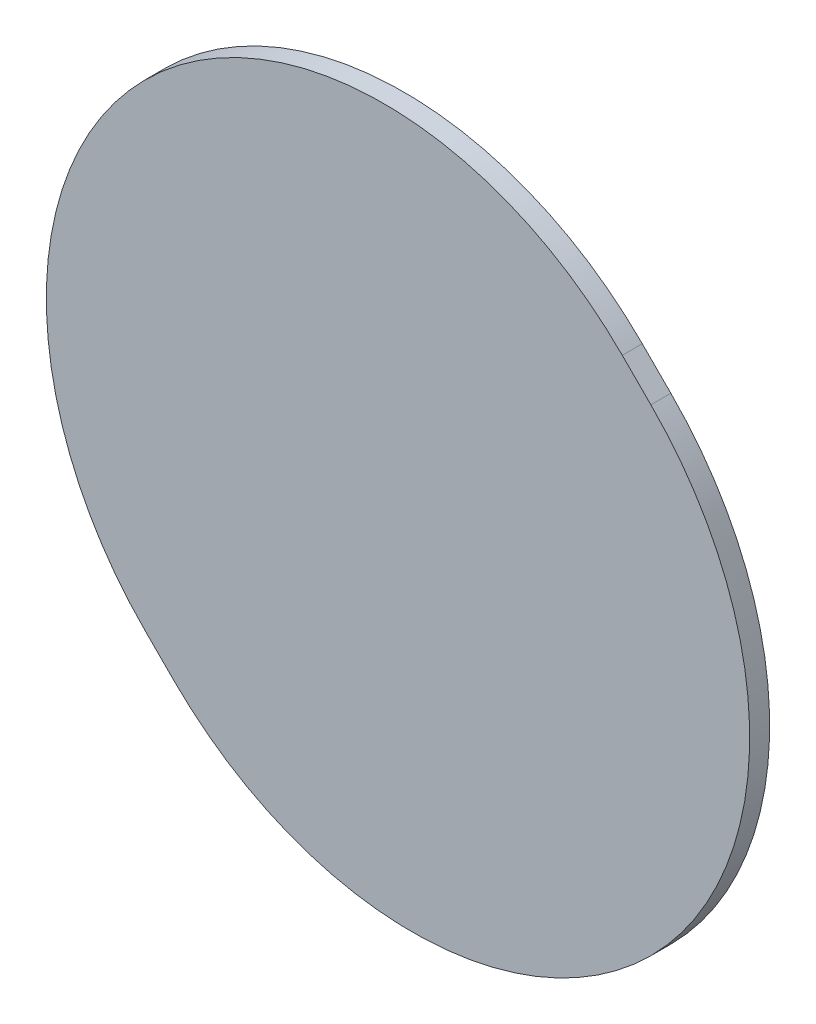
ISO-10303-21;
HEADER;
FILE_DESCRIPTION(('STEP AP214'),'2;1');
FILE_NAME('part.step','',(''),(''),'','','');
FILE_SCHEMA(('AUTOMOTIVE_DESIGN { 1 0 10303 214 1 1 1 1 }'));
ENDSEC;
DATA;
#1=APPLICATION_CONTEXT('core data for automotive mechanical design processes');
#2=APPLICATION_PROTOCOL_DEFINITION('international standard','automotive_design',2000,#1);
#3=PRODUCT_CONTEXT('',#1,'mechanical');
#4=PRODUCT('Part','Part','',(#3));
#5=PRODUCT_RELATED_PRODUCT_CATEGORY('part','',(#4));
#6=PRODUCT_DEFINITION_FORMATION('','',#4);
#7=PRODUCT_DEFINITION_CONTEXT('part definition',#1,'design');
#8=PRODUCT_DEFINITION('design','',#6,#7);
#9=PRODUCT_DEFINITION_SHAPE('','',#8);
#10=(LENGTH_UNIT() NAMED_UNIT(*) SI_UNIT(.MILLI.,.METRE.));
#11=(NAMED_UNIT(*) PLANE_ANGLE_UNIT() SI_UNIT($,.RADIAN.));
#12=(NAMED_UNIT(*) SI_UNIT($,.STERADIAN.) SOLID_ANGLE_UNIT());
#13=UNCERTAINTY_MEASURE_WITH_UNIT(LENGTH_MEASURE(1.E-05),#10,'distance_accuracy_value','');
#14=(GEOMETRIC_REPRESENTATION_CONTEXT(3) GLOBAL_UNCERTAINTY_ASSIGNED_CONTEXT((#13)) GLOBAL_UNIT_ASSIGNED_CONTEXT((#10,
#11,#12)) REPRESENTATION_CONTEXT('',''));
#15=CARTESIAN_POINT('',(0.,0.,0.));
#16=DIRECTION('',(0.,0.,1.));
#17=DIRECTION('',(1.,0.,0.));
#18=AXIS2_PLACEMENT_3D('',#15,#16,#17);
#19=CARTESIAN_POINT('',(90.76173618,70.20658298,0.));
#20=DIRECTION('',(0.707106781186548,0.707106781186548,0.));
#21=DIRECTION('',(0.707106781186548,-0.707106781186548,0.));
#22=AXIS2_PLACEMENT_3D('',#19,#20,#21);
#23=PLANE('',#22);
#24=DIRECTION('',(0.707106781186548,-0.707106781186548,0.));
#25=VECTOR('',#24,1.);
#26=CARTESIAN_POINT('',(90.76173618,70.20658298,0.03556));
#27=LINE('',#26,#25);
#28=CARTESIAN_POINT('',(90.76173618,70.20658298,0.03556));
#29=VERTEX_POINT('',#28);
#30=CARTESIAN_POINT('',(90.81253618,70.15578298,0.03556));
#31=VERTEX_POINT('',#30);
#32=EDGE_CURVE('E11',#29,#31,#27,.T.);
#33=ORIENTED_EDGE('',*,*,#32,.F.);
#34=DIRECTION('',(0.,0.,1.));
#35=VECTOR('',#34,1.);
#36=CARTESIAN_POINT('',(90.76173618,70.20658298,0.));
#37=LINE('',#36,#35);
#38=CARTESIAN_POINT('',(90.76173618,70.20658298,0.));
#39=VERTEX_POINT('',#38);
#40=EDGE_CURVE('E24',#39,#29,#37,.T.);
#41=ORIENTED_EDGE('',*,*,#40,.F.);
#42=DIRECTION('',(0.707106781186548,-0.707106781186548,0.));
#43=VECTOR('',#42,1.);
#44=CARTESIAN_POINT('',(90.76173618,70.20658298,0.));
#45=LINE('',#44,#43);
#46=CARTESIAN_POINT('',(90.81253618,70.15578298,0.));
#47=VERTEX_POINT('',#46);
#48=EDGE_CURVE('E75',#39,#47,#45,.T.);
#49=ORIENTED_EDGE('',*,*,#48,.T.);
#50=DIRECTION('',(0.,0.,1.));
#51=VECTOR('',#50,1.);
#52=CARTESIAN_POINT('',(90.81253618,70.15578298,0.));
#53=LINE('',#52,#51);
#54=EDGE_CURVE('E37',#47,#31,#53,.T.);
#55=ORIENTED_EDGE('',*,*,#54,.T.);
#56=EDGE_LOOP('',(#33,#41,#49,#55));
#57=FACE_BOUND('',#56,.T.);
#58=ADVANCED_FACE('F17',(#57),#23,.F.);
#59=CARTESIAN_POINT('',(91.2368,70.5800468,0.));
#60=DIRECTION('',(0.,0.,-1.));
#61=DIRECTION('',(-0.707106781186548,-0.707106781186548,0.));
#62=AXIS2_PLACEMENT_3D('',#59,#60,#61);
#63=CYLINDRICAL_SURFACE('',#62,0.599999648268218);
#64=CARTESIAN_POINT('',(91.2368,70.5800468,0.03556));
#65=DIRECTION('',(0.,0.,1.));
#66=DIRECTION('',(-0.707106781186548,-0.707106781186548,0.));
#67=AXIS2_PLACEMENT_3D('',#64,#65,#66);
#68=CIRCLE('',#67,0.599999648268218);
#69=CARTESIAN_POINT('',(91.66106382,71.00431062,0.03556));
#70=VERTEX_POINT('',#69);
#71=EDGE_CURVE('E83',#31,#70,#68,.T.);
#72=ORIENTED_EDGE('',*,*,#71,.F.);
#73=ORIENTED_EDGE('',*,*,#54,.F.);
#74=CARTESIAN_POINT('',(91.2368,70.5800468,0.));
#75=DIRECTION('',(0.,0.,1.));
#76=DIRECTION('',(-0.707106781186548,-0.707106781186548,0.));
#77=AXIS2_PLACEMENT_3D('',#74,#75,#76);
#78=CIRCLE('',#77,0.599999648268218);
#79=CARTESIAN_POINT('',(91.66106382,71.00431062,0.));
#80=VERTEX_POINT('',#79);
#81=EDGE_CURVE('E81',#47,#80,#78,.T.);
#82=ORIENTED_EDGE('',*,*,#81,.T.);
#83=DIRECTION('',(0.,0.,1.));
#84=VECTOR('',#83,1.);
#85=CARTESIAN_POINT('',(91.66106382,71.00431062,0.));
#86=LINE('',#85,#84);
#87=EDGE_CURVE('E67',#80,#70,#86,.T.);
#88=ORIENTED_EDGE('',*,*,#87,.T.);
#89=EDGE_LOOP('',(#72,#73,#82,#88));
#90=FACE_BOUND('',#89,.T.);
#91=ADVANCED_FACE('F89',(#90),#63,.T.);
#92=CARTESIAN_POINT('',(91.66106382,71.00431062,0.));
#93=DIRECTION('',(-0.707106781186449,-0.707106781186646,0.));
#94=DIRECTION('',(-0.707106781186646,0.707106781186449,0.));
#95=AXIS2_PLACEMENT_3D('',#92,#93,#94);
#96=PLANE('',#95);
#97=DIRECTION('',(-0.707106781186646,0.707106781186449,0.));
#98=VECTOR('',#97,1.);
#99=CARTESIAN_POINT('',(91.66106382,71.00431062,0.03556));
#100=LINE('',#99,#98);
#101=CARTESIAN_POINT('',(91.61026382,71.05511062,0.03556));
#102=VERTEX_POINT('',#101);
#103=EDGE_CURVE('E71',#70,#102,#100,.T.);
#104=ORIENTED_EDGE('',*,*,#103,.F.);
#105=ORIENTED_EDGE('',*,*,#87,.F.);
#106=DIRECTION('',(-0.707106781186646,0.707106781186449,0.));
#107=VECTOR('',#106,1.);
#108=CARTESIAN_POINT('',(91.66106382,71.00431062,0.));
#109=LINE('',#108,#107);
#110=CARTESIAN_POINT('',(91.61026382,71.05511062,0.));
#111=VERTEX_POINT('',#110);
#112=EDGE_CURVE('E63',#80,#111,#109,.T.);
#113=ORIENTED_EDGE('',*,*,#112,.T.);
#114=DIRECTION('',(0.,0.,1.));
#115=VECTOR('',#114,1.);
#116=CARTESIAN_POINT('',(91.61026382,71.05511062,0.));
#117=LINE('',#116,#115);
#118=EDGE_CURVE('E53',#111,#102,#117,.T.);
#119=ORIENTED_EDGE('',*,*,#118,.T.);
#120=EDGE_LOOP('',(#104,#105,#113,#119));
#121=FACE_BOUND('',#120,.T.);
#122=ADVANCED_FACE('F66',(#121),#96,.F.);
#123=CARTESIAN_POINT('',(91.186,70.6308468,0.));
#124=DIRECTION('',(0.,0.,-1.));
#125=DIRECTION('',(0.707106781186548,0.707106781186548,0.));
#126=AXIS2_PLACEMENT_3D('',#123,#124,#125);
#127=CYLINDRICAL_SURFACE('',#126,0.599999648268211);
#128=CARTESIAN_POINT('',(91.186,70.6308468,0.03556));
#129=DIRECTION('',(0.,0.,1.));
#130=DIRECTION('',(0.707106781186548,0.707106781186548,0.));
#131=AXIS2_PLACEMENT_3D('',#128,#129,#130);
#132=CIRCLE('',#131,0.599999648268211);
#133=EDGE_CURVE('E59',#102,#29,#132,.T.);
#134=ORIENTED_EDGE('',*,*,#133,.F.);
#135=ORIENTED_EDGE('',*,*,#118,.F.);
#136=CARTESIAN_POINT('',(91.186,70.6308468,0.));
#137=DIRECTION('',(0.,0.,1.));
#138=DIRECTION('',(0.707106781186548,0.707106781186548,0.));
#139=AXIS2_PLACEMENT_3D('',#136,#137,#138);
#140=CIRCLE('',#139,0.599999648268211);
#141=EDGE_CURVE('E57',#111,#39,#140,.T.);
#142=ORIENTED_EDGE('',*,*,#141,.T.);
#143=ORIENTED_EDGE('',*,*,#40,.T.);
#144=EDGE_LOOP('',(#134,#135,#142,#143));
#145=FACE_BOUND('',#144,.T.);
#146=ADVANCED_FACE('F55',(#145),#127,.T.);
#147=CARTESIAN_POINT('',(90.76173618,70.20658298,0.));
#148=DIRECTION('',(0.,0.,-1.));
#149=DIRECTION('',(-1.,0.,0.));
#150=AXIS2_PLACEMENT_3D('',#147,#148,#149);
#151=PLANE('',#150);
#152=ORIENTED_EDGE('',*,*,#141,.F.);
#153=ORIENTED_EDGE('',*,*,#112,.F.);
#154=ORIENTED_EDGE('',*,*,#81,.F.);
#155=ORIENTED_EDGE('',*,*,#48,.F.);
#156=EDGE_LOOP('',(#152,#153,#154,#155));
#157=FACE_BOUND('',#156,.T.);
#158=ADVANCED_FACE('F74',(#157),#151,.T.);
#159=CARTESIAN_POINT('',(90.76173618,70.20658298,0.03556));
#160=DIRECTION('',(0.,0.,-1.));
#161=DIRECTION('',(-1.,0.,0.));
#162=AXIS2_PLACEMENT_3D('',#159,#160,#161);
#163=PLANE('',#162);
#164=ORIENTED_EDGE('',*,*,#32,.T.);
#165=ORIENTED_EDGE('',*,*,#71,.T.);
#166=ORIENTED_EDGE('',*,*,#103,.T.);
#167=ORIENTED_EDGE('',*,*,#133,.T.);
#168=EDGE_LOOP('',(#164,#165,#166,#167));
#169=FACE_BOUND('',#168,.T.);
#170=ADVANCED_FACE('F91',(#169),#163,.F.);
#171=CLOSED_SHELL('',(#58,#91,#122,#146,#158,#170));
#172=MANIFOLD_SOLID_BREP('B1',#171);
#173=ADVANCED_BREP_SHAPE_REPRESENTATION('',(#18,#172),#14);
#174=SHAPE_DEFINITION_REPRESENTATION(#9,#173);
ENDSEC;
END-ISO-10303-21;
